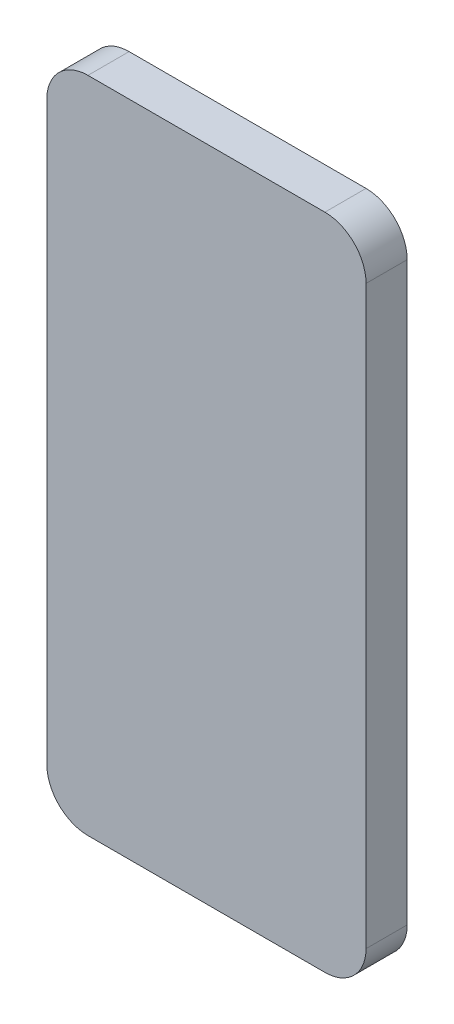
ISO-10303-21;
HEADER;
FILE_DESCRIPTION(('STEP AP214'),'2;1');
FILE_NAME('part.step','',(''),(''),'','','');
FILE_SCHEMA(('AUTOMOTIVE_DESIGN { 1 0 10303 214 1 1 1 1 }'));
ENDSEC;
DATA;
#1=APPLICATION_CONTEXT('core data for automotive mechanical design processes');
#2=APPLICATION_PROTOCOL_DEFINITION('international standard','automotive_design',2000,#1);
#3=PRODUCT_CONTEXT('',#1,'mechanical');
#4=PRODUCT('Part','Part','',(#3));
#5=PRODUCT_RELATED_PRODUCT_CATEGORY('part','',(#4));
#6=PRODUCT_DEFINITION_FORMATION('','',#4);
#7=PRODUCT_DEFINITION_CONTEXT('part definition',#1,'design');
#8=PRODUCT_DEFINITION('design','',#6,#7);
#9=PRODUCT_DEFINITION_SHAPE('','',#8);
#10=(LENGTH_UNIT() NAMED_UNIT(*) SI_UNIT(.MILLI.,.METRE.));
#11=(NAMED_UNIT(*) PLANE_ANGLE_UNIT() SI_UNIT($,.RADIAN.));
#12=(NAMED_UNIT(*) SI_UNIT($,.STERADIAN.) SOLID_ANGLE_UNIT());
#13=UNCERTAINTY_MEASURE_WITH_UNIT(LENGTH_MEASURE(1.E-05),#10,'distance_accuracy_value','');
#14=(GEOMETRIC_REPRESENTATION_CONTEXT(3) GLOBAL_UNCERTAINTY_ASSIGNED_CONTEXT((#13)) GLOBAL_UNIT_ASSIGNED_CONTEXT((#10,
#11,#12)) REPRESENTATION_CONTEXT('',''));
#15=CARTESIAN_POINT('',(0.,0.,0.));
#16=DIRECTION('',(0.,0.,1.));
#17=DIRECTION('',(1.,0.,0.));
#18=AXIS2_PLACEMENT_3D('',#15,#16,#17);
#19=CARTESIAN_POINT('',(28.79,-107.020681870739,10.));
#20=DIRECTION('',(0.,0.,-1.));
#21=DIRECTION('',(-1.,0.,0.));
#22=AXIS2_PLACEMENT_3D('',#19,#20,#21);
#23=CYLINDRICAL_SURFACE('',#22,10.);
#24=CARTESIAN_POINT('',(28.79,-107.020681870739,0.));
#25=DIRECTION('',(0.,0.,1.));
#26=DIRECTION('',(1.,0.,0.));
#27=AXIS2_PLACEMENT_3D('',#24,#25,#26);
#28=CIRCLE('',#27,10.);
#29=CARTESIAN_POINT('',(28.7899999999999,-117.020681870739,0.));
#30=VERTEX_POINT('',#29);
#31=CARTESIAN_POINT('',(38.79,-107.020681870739,0.));
#32=VERTEX_POINT('',#31);
#33=EDGE_CURVE('E129',#30,#32,#28,.T.);
#34=ORIENTED_EDGE('',*,*,#33,.T.);
#35=DIRECTION('',(0.,0.,-1.));
#36=VECTOR('',#35,1.);
#37=CARTESIAN_POINT('',(38.79,-107.020681870739,10.));
#38=LINE('',#37,#36);
#39=CARTESIAN_POINT('',(38.79,-107.020681870739,10.));
#40=VERTEX_POINT('',#39);
#41=EDGE_CURVE('E11',#40,#32,#38,.T.);
#42=ORIENTED_EDGE('',*,*,#41,.F.);
#43=CARTESIAN_POINT('',(28.79,-107.020681870739,10.));
#44=DIRECTION('',(0.,0.,1.));
#45=DIRECTION('',(1.,0.,0.));
#46=AXIS2_PLACEMENT_3D('',#43,#44,#45);
#47=CIRCLE('',#46,10.);
#48=CARTESIAN_POINT('',(28.7899999999999,-117.020681870739,10.));
#49=VERTEX_POINT('',#48);
#50=EDGE_CURVE('E143',#49,#40,#47,.T.);
#51=ORIENTED_EDGE('',*,*,#50,.F.);
#52=DIRECTION('',(0.,0.,-1.));
#53=VECTOR('',#52,1.);
#54=CARTESIAN_POINT('',(28.7899999999999,-117.020681870739,10.));
#55=LINE('',#54,#53);
#56=EDGE_CURVE('E125',#49,#30,#55,.T.);
#57=ORIENTED_EDGE('',*,*,#56,.T.);
#58=EDGE_LOOP('',(#34,#42,#51,#57));
#59=FACE_BOUND('',#58,.T.);
#60=ADVANCED_FACE('F33',(#59),#23,.T.);
#61=CARTESIAN_POINT('',(38.79,32.9793181292613,10.));
#62=DIRECTION('',(-1.,0.,0.));
#63=DIRECTION('',(0.,-1.,0.));
#64=AXIS2_PLACEMENT_3D('',#61,#62,#63);
#65=PLANE('',#64);
#66=DIRECTION('',(0.,1.,0.));
#67=VECTOR('',#66,1.);
#68=CARTESIAN_POINT('',(38.79,32.9793181292613,0.));
#69=LINE('',#68,#67);
#70=CARTESIAN_POINT('',(38.79,32.9793181292613,0.));
#71=VERTEX_POINT('',#70);
#72=EDGE_CURVE('E132',#32,#71,#69,.T.);
#73=ORIENTED_EDGE('',*,*,#72,.T.);
#74=DIRECTION('',(0.,0.,-1.));
#75=VECTOR('',#74,1.);
#76=CARTESIAN_POINT('',(38.79,32.9793181292613,10.));
#77=LINE('',#76,#75);
#78=CARTESIAN_POINT('',(38.79,32.9793181292613,10.));
#79=VERTEX_POINT('',#78);
#80=EDGE_CURVE('E41',#79,#71,#77,.T.);
#81=ORIENTED_EDGE('',*,*,#80,.F.);
#82=DIRECTION('',(0.,1.,0.));
#83=VECTOR('',#82,1.);
#84=CARTESIAN_POINT('',(38.79,32.9793181292613,10.));
#85=LINE('',#84,#83);
#86=EDGE_CURVE('E92',#40,#79,#85,.T.);
#87=ORIENTED_EDGE('',*,*,#86,.F.);
#88=ORIENTED_EDGE('',*,*,#41,.T.);
#89=EDGE_LOOP('',(#73,#81,#87,#88));
#90=FACE_BOUND('',#89,.T.);
#91=ADVANCED_FACE('F178',(#90),#65,.F.);
#92=CARTESIAN_POINT('',(28.79,32.9793181292614,10.));
#93=DIRECTION('',(0.,0.,-1.));
#94=DIRECTION('',(-1.,0.,0.));
#95=AXIS2_PLACEMENT_3D('',#92,#93,#94);
#96=CYLINDRICAL_SURFACE('',#95,10.);
#97=CARTESIAN_POINT('',(28.79,32.9793181292614,0.));
#98=DIRECTION('',(0.,0.,1.));
#99=DIRECTION('',(-1.,0.,0.));
#100=AXIS2_PLACEMENT_3D('',#97,#98,#99);
#101=CIRCLE('',#100,10.);
#102=CARTESIAN_POINT('',(28.7899999999999,42.9793181292614,0.));
#103=VERTEX_POINT('',#102);
#104=EDGE_CURVE('E134',#71,#103,#101,.T.);
#105=ORIENTED_EDGE('',*,*,#104,.T.);
#106=DIRECTION('',(0.,0.,-1.));
#107=VECTOR('',#106,1.);
#108=CARTESIAN_POINT('',(28.7899999999999,42.9793181292614,10.));
#109=LINE('',#108,#107);
#110=CARTESIAN_POINT('',(28.7899999999999,42.9793181292614,10.));
#111=VERTEX_POINT('',#110);
#112=EDGE_CURVE('E150',#111,#103,#109,.T.);
#113=ORIENTED_EDGE('',*,*,#112,.F.);
#114=CARTESIAN_POINT('',(28.79,32.9793181292614,10.));
#115=DIRECTION('',(0.,0.,1.));
#116=DIRECTION('',(-1.,0.,0.));
#117=AXIS2_PLACEMENT_3D('',#114,#115,#116);
#118=CIRCLE('',#117,10.);
#119=EDGE_CURVE('E158',#79,#111,#118,.T.);
#120=ORIENTED_EDGE('',*,*,#119,.F.);
#121=ORIENTED_EDGE('',*,*,#80,.T.);
#122=EDGE_LOOP('',(#105,#113,#120,#121));
#123=FACE_BOUND('',#122,.T.);
#124=ADVANCED_FACE('F156',(#123),#96,.T.);
#125=CARTESIAN_POINT('',(-28.7899999999999,42.9793181292614,10.));
#126=DIRECTION('',(0.,-1.,0.));
#127=DIRECTION('',(0.,0.,-1.));
#128=AXIS2_PLACEMENT_3D('',#125,#126,#127);
#129=PLANE('',#128);
#130=DIRECTION('',(-1.,0.,0.));
#131=VECTOR('',#130,1.);
#132=CARTESIAN_POINT('',(-28.7899999999999,42.9793181292614,0.));
#133=LINE('',#132,#131);
#134=CARTESIAN_POINT('',(-28.7899999999999,42.9793181292614,0.));
#135=VERTEX_POINT('',#134);
#136=EDGE_CURVE('E136',#103,#135,#133,.T.);
#137=ORIENTED_EDGE('',*,*,#136,.T.);
#138=DIRECTION('',(0.,0.,-1.));
#139=VECTOR('',#138,1.);
#140=CARTESIAN_POINT('',(-28.7899999999999,42.9793181292614,10.));
#141=LINE('',#140,#139);
#142=CARTESIAN_POINT('',(-28.7899999999999,42.9793181292614,10.));
#143=VERTEX_POINT('',#142);
#144=EDGE_CURVE('E147',#143,#135,#141,.T.);
#145=ORIENTED_EDGE('',*,*,#144,.F.);
#146=DIRECTION('',(-1.,0.,0.));
#147=VECTOR('',#146,1.);
#148=CARTESIAN_POINT('',(-28.7899999999999,42.9793181292614,10.));
#149=LINE('',#148,#147);
#150=EDGE_CURVE('E170',#111,#143,#149,.T.);
#151=ORIENTED_EDGE('',*,*,#150,.F.);
#152=ORIENTED_EDGE('',*,*,#112,.T.);
#153=EDGE_LOOP('',(#137,#145,#151,#152));
#154=FACE_BOUND('',#153,.T.);
#155=ADVANCED_FACE('F166',(#154),#129,.F.);
#156=CARTESIAN_POINT('',(-28.79,32.9793181292614,10.));
#157=DIRECTION('',(0.,0.,-1.));
#158=DIRECTION('',(-1.,0.,0.));
#159=AXIS2_PLACEMENT_3D('',#156,#157,#158);
#160=CYLINDRICAL_SURFACE('',#159,10.);
#161=CARTESIAN_POINT('',(-28.79,32.9793181292614,0.));
#162=DIRECTION('',(0.,0.,1.));
#163=DIRECTION('',(1.,0.,0.));
#164=AXIS2_PLACEMENT_3D('',#161,#162,#163);
#165=CIRCLE('',#164,10.);
#166=CARTESIAN_POINT('',(-38.79,32.9793181292613,0.));
#167=VERTEX_POINT('',#166);
#168=EDGE_CURVE('E138',#135,#167,#165,.T.);
#169=ORIENTED_EDGE('',*,*,#168,.T.);
#170=DIRECTION('',(0.,0.,-1.));
#171=VECTOR('',#170,1.);
#172=CARTESIAN_POINT('',(-38.79,32.9793181292613,10.));
#173=LINE('',#172,#171);
#174=CARTESIAN_POINT('',(-38.79,32.9793181292613,10.));
#175=VERTEX_POINT('',#174);
#176=EDGE_CURVE('E120',#175,#167,#173,.T.);
#177=ORIENTED_EDGE('',*,*,#176,.F.);
#178=CARTESIAN_POINT('',(-28.79,32.9793181292614,10.));
#179=DIRECTION('',(0.,0.,1.));
#180=DIRECTION('',(1.,0.,0.));
#181=AXIS2_PLACEMENT_3D('',#178,#179,#180);
#182=CIRCLE('',#181,10.);
#183=EDGE_CURVE('E111',#143,#175,#182,.T.);
#184=ORIENTED_EDGE('',*,*,#183,.F.);
#185=ORIENTED_EDGE('',*,*,#144,.T.);
#186=EDGE_LOOP('',(#169,#177,#184,#185));
#187=FACE_BOUND('',#186,.T.);
#188=ADVANCED_FACE('F169',(#187),#160,.T.);
#189=CARTESIAN_POINT('',(-38.79,32.9793181292613,10.));
#190=DIRECTION('',(1.,0.,0.));
#191=DIRECTION('',(0.,1.,0.));
#192=AXIS2_PLACEMENT_3D('',#189,#190,#191);
#193=PLANE('',#192);
#194=DIRECTION('',(0.,-1.,0.));
#195=VECTOR('',#194,1.);
#196=CARTESIAN_POINT('',(-38.79,32.9793181292613,0.));
#197=LINE('',#196,#195);
#198=CARTESIAN_POINT('',(-38.79,-107.020681870739,0.));
#199=VERTEX_POINT('',#198);
#200=EDGE_CURVE('E119',#167,#199,#197,.T.);
#201=ORIENTED_EDGE('',*,*,#200,.T.);
#202=DIRECTION('',(0.,0.,-1.));
#203=VECTOR('',#202,1.);
#204=CARTESIAN_POINT('',(-38.79,-107.020681870739,10.));
#205=LINE('',#204,#203);
#206=CARTESIAN_POINT('',(-38.79,-107.020681870739,10.));
#207=VERTEX_POINT('',#206);
#208=EDGE_CURVE('E116',#207,#199,#205,.T.);
#209=ORIENTED_EDGE('',*,*,#208,.F.);
#210=DIRECTION('',(0.,-1.,0.));
#211=VECTOR('',#210,1.);
#212=CARTESIAN_POINT('',(-38.79,32.9793181292613,10.));
#213=LINE('',#212,#211);
#214=EDGE_CURVE('E105',#175,#207,#213,.T.);
#215=ORIENTED_EDGE('',*,*,#214,.F.);
#216=ORIENTED_EDGE('',*,*,#176,.T.);
#217=EDGE_LOOP('',(#201,#209,#215,#216));
#218=FACE_BOUND('',#217,.T.);
#219=ADVANCED_FACE('F117',(#218),#193,.F.);
#220=CARTESIAN_POINT('',(-28.79,-107.020681870739,10.));
#221=DIRECTION('',(0.,0.,-1.));
#222=DIRECTION('',(-1.,0.,0.));
#223=AXIS2_PLACEMENT_3D('',#220,#221,#222);
#224=CYLINDRICAL_SURFACE('',#223,10.);
#225=CARTESIAN_POINT('',(-28.79,-107.020681870739,0.));
#226=DIRECTION('',(0.,0.,1.));
#227=DIRECTION('',(1.,0.,0.));
#228=AXIS2_PLACEMENT_3D('',#225,#226,#227);
#229=CIRCLE('',#228,10.);
#230=CARTESIAN_POINT('',(-28.7899999999999,-117.020681870739,0.));
#231=VERTEX_POINT('',#230);
#232=EDGE_CURVE('E78',#199,#231,#229,.T.);
#233=ORIENTED_EDGE('',*,*,#232,.T.);
#234=DIRECTION('',(0.,0.,-1.));
#235=VECTOR('',#234,1.);
#236=CARTESIAN_POINT('',(-28.7899999999999,-117.020681870739,10.));
#237=LINE('',#236,#235);
#238=CARTESIAN_POINT('',(-28.7899999999999,-117.020681870739,10.));
#239=VERTEX_POINT('',#238);
#240=EDGE_CURVE('E121',#239,#231,#237,.T.);
#241=ORIENTED_EDGE('',*,*,#240,.F.);
#242=CARTESIAN_POINT('',(-28.79,-107.020681870739,10.));
#243=DIRECTION('',(0.,0.,1.));
#244=DIRECTION('',(1.,0.,0.));
#245=AXIS2_PLACEMENT_3D('',#242,#243,#244);
#246=CIRCLE('',#245,10.);
#247=EDGE_CURVE('E109',#207,#239,#246,.T.);
#248=ORIENTED_EDGE('',*,*,#247,.F.);
#249=ORIENTED_EDGE('',*,*,#208,.T.);
#250=EDGE_LOOP('',(#233,#241,#248,#249));
#251=FACE_BOUND('',#250,.T.);
#252=ADVANCED_FACE('F123',(#251),#224,.T.);
#253=CARTESIAN_POINT('',(-28.7899999999999,-117.020681870739,10.));
#254=DIRECTION('',(0.,1.,0.));
#255=DIRECTION('',(0.,0.,1.));
#256=AXIS2_PLACEMENT_3D('',#253,#254,#255);
#257=PLANE('',#256);
#258=DIRECTION('',(1.,0.,0.));
#259=VECTOR('',#258,1.);
#260=CARTESIAN_POINT('',(-28.7899999999999,-117.020681870739,0.));
#261=LINE('',#260,#259);
#262=EDGE_CURVE('E84',#231,#30,#261,.T.);
#263=ORIENTED_EDGE('',*,*,#262,.T.);
#264=ORIENTED_EDGE('',*,*,#56,.F.);
#265=DIRECTION('',(1.,0.,0.));
#266=VECTOR('',#265,1.);
#267=CARTESIAN_POINT('',(-28.7899999999999,-117.020681870739,10.));
#268=LINE('',#267,#266);
#269=EDGE_CURVE('E49',#239,#49,#268,.T.);
#270=ORIENTED_EDGE('',*,*,#269,.F.);
#271=ORIENTED_EDGE('',*,*,#240,.T.);
#272=EDGE_LOOP('',(#263,#264,#270,#271));
#273=FACE_BOUND('',#272,.T.);
#274=ADVANCED_FACE('F194',(#273),#257,.F.);
#275=CARTESIAN_POINT('',(28.79,-107.020681870739,10.));
#276=DIRECTION('',(0.,0.,1.));
#277=DIRECTION('',(1.,0.,0.));
#278=AXIS2_PLACEMENT_3D('',#275,#276,#277);
#279=PLANE('',#278);
#280=ORIENTED_EDGE('',*,*,#50,.T.);
#281=ORIENTED_EDGE('',*,*,#86,.T.);
#282=ORIENTED_EDGE('',*,*,#119,.T.);
#283=ORIENTED_EDGE('',*,*,#150,.T.);
#284=ORIENTED_EDGE('',*,*,#183,.T.);
#285=ORIENTED_EDGE('',*,*,#214,.T.);
#286=ORIENTED_EDGE('',*,*,#247,.T.);
#287=ORIENTED_EDGE('',*,*,#269,.T.);
#288=EDGE_LOOP('',(#280,#281,#282,#283,#284,#285,#286,#287));
#289=FACE_BOUND('',#288,.T.);
#290=ADVANCED_FACE('F107',(#289),#279,.T.);
#291=CARTESIAN_POINT('',(28.79,-107.020681870739,0.));
#292=DIRECTION('',(0.,0.,1.));
#293=DIRECTION('',(1.,0.,0.));
#294=AXIS2_PLACEMENT_3D('',#291,#292,#293);
#295=PLANE('',#294);
#296=ORIENTED_EDGE('',*,*,#33,.F.);
#297=ORIENTED_EDGE('',*,*,#262,.F.);
#298=ORIENTED_EDGE('',*,*,#232,.F.);
#299=ORIENTED_EDGE('',*,*,#200,.F.);
#300=ORIENTED_EDGE('',*,*,#168,.F.);
#301=ORIENTED_EDGE('',*,*,#136,.F.);
#302=ORIENTED_EDGE('',*,*,#104,.F.);
#303=ORIENTED_EDGE('',*,*,#72,.F.);
#304=EDGE_LOOP('',(#296,#297,#298,#299,#300,#301,#302,#303));
#305=FACE_BOUND('',#304,.T.);
#306=ADVANCED_FACE('F162',(#305),#295,.F.);
#307=CLOSED_SHELL('',(#60,#91,#124,#155,#188,#219,#252,#274,#290,#306));
#308=MANIFOLD_SOLID_BREP('B2',#307);
#309=ADVANCED_BREP_SHAPE_REPRESENTATION('',(#18,#308),#14);
#310=SHAPE_DEFINITION_REPRESENTATION(#9,#309);
ENDSEC;
END-ISO-10303-21;
